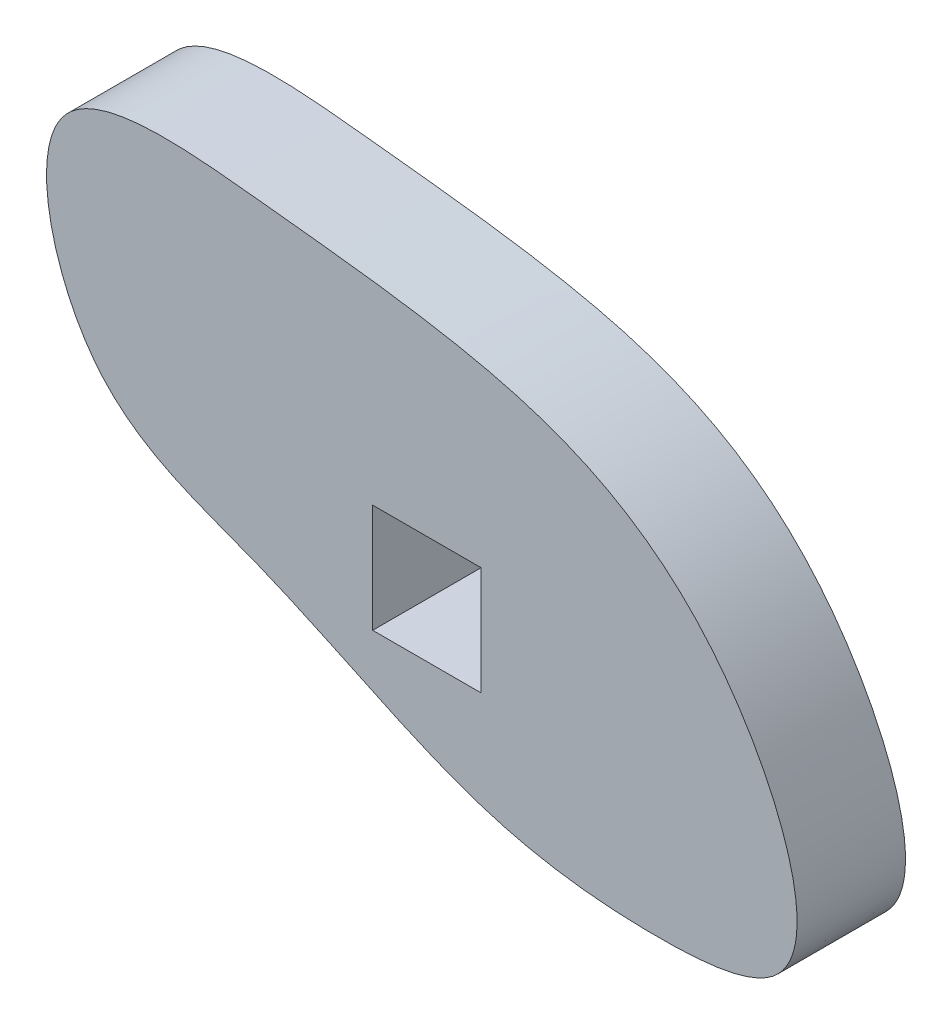
ISO-10303-21;
HEADER;
FILE_DESCRIPTION(('STEP AP214'),'2;1');
FILE_NAME('part.step','',(''),(''),'','','');
FILE_SCHEMA(('AUTOMOTIVE_DESIGN { 1 0 10303 214 1 1 1 1 }'));
ENDSEC;
DATA;
#1=APPLICATION_CONTEXT('core data for automotive mechanical design processes');
#2=APPLICATION_PROTOCOL_DEFINITION('international standard','automotive_design',2000,#1);
#3=PRODUCT_CONTEXT('',#1,'mechanical');
#4=PRODUCT('Part','Part','',(#3));
#5=PRODUCT_RELATED_PRODUCT_CATEGORY('part','',(#4));
#6=PRODUCT_DEFINITION_FORMATION('','',#4);
#7=PRODUCT_DEFINITION_CONTEXT('part definition',#1,'design');
#8=PRODUCT_DEFINITION('design','',#6,#7);
#9=PRODUCT_DEFINITION_SHAPE('','',#8);
#10=(LENGTH_UNIT() NAMED_UNIT(*) SI_UNIT(.MILLI.,.METRE.));
#11=(NAMED_UNIT(*) PLANE_ANGLE_UNIT() SI_UNIT($,.RADIAN.));
#12=(NAMED_UNIT(*) SI_UNIT($,.STERADIAN.) SOLID_ANGLE_UNIT());
#13=UNCERTAINTY_MEASURE_WITH_UNIT(LENGTH_MEASURE(1.E-05),#10,'distance_accuracy_value','');
#14=(GEOMETRIC_REPRESENTATION_CONTEXT(3) GLOBAL_UNCERTAINTY_ASSIGNED_CONTEXT((#13)) GLOBAL_UNIT_ASSIGNED_CONTEXT((#10,
#11,#12)) REPRESENTATION_CONTEXT('',''));
#15=CARTESIAN_POINT('',(0.,0.,0.));
#16=DIRECTION('',(0.,0.,1.));
#17=DIRECTION('',(1.,0.,0.));
#18=AXIS2_PLACEMENT_3D('',#15,#16,#17);
#19=CARTESIAN_POINT('',(6.23276976120048,65.2670859887159,1.524));
#20=DIRECTION('',(0.,0.,-1.));
#21=DIRECTION('',(-1.,0.,0.));
#22=AXIS2_PLACEMENT_3D('',#19,#20,#21);
#23=PLANE('',#22);
#24=CARTESIAN_POINT('',(7.78821083389061,59.6373775356015,1.524));
#25=CARTESIAN_POINT('',(8.55242861925409,59.3920195251449,1.524));
#26=CARTESIAN_POINT('',(9.87105853028132,59.2065251548185,1.524));
#27=CARTESIAN_POINT('',(12.9933090121217,59.4290503746136,1.524));
#28=CARTESIAN_POINT('',(11.1452780041047,64.0958208279682,1.524));
#29=CARTESIAN_POINT('',(7.76826039007349,65.1208617976935,1.524));
#30=CARTESIAN_POINT('',(4.81034353812184,65.4252300243392,1.524));
#31=CARTESIAN_POINT('',(1.10894430118295,65.8389714995074,1.524));
#32=CARTESIAN_POINT('',(2.04294960883038,61.8155299158975,1.524));
#33=CARTESIAN_POINT('',(4.95322939789916,61.021597326962,1.524));
#34=CARTESIAN_POINT('',(6.72903311877762,59.9774347050071,1.524));
#35=CARTESIAN_POINT('',(7.78821083389061,59.6373775356015,1.524));
#36=B_SPLINE_CURVE_WITH_KNOTS('',3,(#24,#25,#26,#27,#28,#29,#30,#31,#32,#33,#34,#35),
.UNSPECIFIED.,.T.,.F.,(4,1,1,1,1,1,1,1,1,4),(0.,0.094464637568492,0.158662880221809,
0.295651602533166,0.457810616264641,0.557025317189154,0.663282087189331,0.771859744080268,
0.869075490135075,1.),.UNSPECIFIED.);
#37=CARTESIAN_POINT('',(7.78821083389061,59.6373775356015,1.524));
#38=VERTEX_POINT('',#37);
#39=EDGE_CURVE('E11',#38,#38,#36,.T.);
#40=ORIENTED_EDGE('',*,*,#39,.T.);
#41=EDGE_LOOP('',(#40));
#42=FACE_BOUND('',#41,.T.);
#43=DIRECTION('',(0.,1.,0.));
#44=VECTOR('',#43,1.);
#45=CARTESIAN_POINT('',(7.78821083389061,62.5331543063582,1.524));
#46=LINE('',#45,#44);
#47=CARTESIAN_POINT('',(7.78821083389061,61.0091543063582,1.524));
#48=VERTEX_POINT('',#47);
#49=CARTESIAN_POINT('',(7.78821083389061,62.5331543063582,1.524));
#50=VERTEX_POINT('',#49);
#51=EDGE_CURVE('E74',#48,#50,#46,.T.);
#52=ORIENTED_EDGE('',*,*,#51,.F.);
#53=DIRECTION('',(1.,0.,0.));
#54=VECTOR('',#53,1.);
#55=CARTESIAN_POINT('',(7.78821083389061,61.0091543063582,1.524));
#56=LINE('',#55,#54);
#57=CARTESIAN_POINT('',(6.26421083389062,61.0091543063582,1.524));
#58=VERTEX_POINT('',#57);
#59=EDGE_CURVE('E95',#58,#48,#56,.T.);
#60=ORIENTED_EDGE('',*,*,#59,.F.);
#61=DIRECTION('',(0.,-1.,0.));
#62=VECTOR('',#61,1.);
#63=CARTESIAN_POINT('',(6.26421083389062,62.5331543063582,1.524));
#64=LINE('',#63,#62);
#65=CARTESIAN_POINT('',(6.26421083389062,62.5331543063582,1.524));
#66=VERTEX_POINT('',#65);
#67=EDGE_CURVE('E93',#66,#58,#64,.T.);
#68=ORIENTED_EDGE('',*,*,#67,.F.);
#69=DIRECTION('',(-1.,0.,0.));
#70=VECTOR('',#69,1.);
#71=CARTESIAN_POINT('',(7.78821083389061,62.5331543063582,1.524));
#72=LINE('',#71,#70);
#73=EDGE_CURVE('E82',#50,#66,#72,.T.);
#74=ORIENTED_EDGE('',*,*,#73,.F.);
#75=EDGE_LOOP('',(#52,#60,#68,#74));
#76=FACE_BOUND('',#75,.T.);
#77=ADVANCED_FACE('F31',(#42,#76),#23,.F.);
#78=CARTESIAN_POINT('',(6.23276976120048,65.2670859887159,0.));
#79=DIRECTION('',(0.,0.,-1.));
#80=DIRECTION('',(-1.,0.,0.));
#81=AXIS2_PLACEMENT_3D('',#78,#79,#80);
#82=PLANE('',#81);
#83=CARTESIAN_POINT('',(7.78821083389061,59.6373775356015,0.));
#84=CARTESIAN_POINT('',(8.55242861925409,59.3920195251449,0.));
#85=CARTESIAN_POINT('',(9.87105853028132,59.2065251548185,0.));
#86=CARTESIAN_POINT('',(12.9933090121217,59.4290503746136,0.));
#87=CARTESIAN_POINT('',(11.1452780041047,64.0958208279682,0.));
#88=CARTESIAN_POINT('',(7.76826039007349,65.1208617976935,0.));
#89=CARTESIAN_POINT('',(4.81034353812184,65.4252300243392,0.));
#90=CARTESIAN_POINT('',(1.10894430118295,65.8389714995074,0.));
#91=CARTESIAN_POINT('',(2.04294960883038,61.8155299158975,0.));
#92=CARTESIAN_POINT('',(4.95322939789916,61.021597326962,0.));
#93=CARTESIAN_POINT('',(6.72903311877762,59.9774347050071,0.));
#94=CARTESIAN_POINT('',(7.78821083389061,59.6373775356015,0.));
#95=B_SPLINE_CURVE_WITH_KNOTS('',3,(#83,#84,#85,#86,#87,#88,#89,#90,#91,#92,#93,#94),
.UNSPECIFIED.,.T.,.F.,(4,1,1,1,1,1,1,1,1,4),(0.,0.094464637568492,0.158662880221809,
0.295651602533166,0.457810616264641,0.557025317189154,0.663282087189331,0.771859744080268,
0.869075490135075,1.),.UNSPECIFIED.);
#96=CARTESIAN_POINT('',(7.78821083389061,59.6373775356015,0.));
#97=VERTEX_POINT('',#96);
#98=EDGE_CURVE('E36',#97,#97,#95,.T.);
#99=ORIENTED_EDGE('',*,*,#98,.F.);
#100=EDGE_LOOP('',(#99));
#101=FACE_BOUND('',#100,.T.);
#102=DIRECTION('',(1.,0.,0.));
#103=VECTOR('',#102,1.);
#104=CARTESIAN_POINT('',(7.78821083389061,61.0091543063582,0.));
#105=LINE('',#104,#103);
#106=CARTESIAN_POINT('',(6.26421083389062,61.0091543063582,0.));
#107=VERTEX_POINT('',#106);
#108=CARTESIAN_POINT('',(7.78821083389061,61.0091543063582,0.));
#109=VERTEX_POINT('',#108);
#110=EDGE_CURVE('E83',#107,#109,#105,.T.);
#111=ORIENTED_EDGE('',*,*,#110,.T.);
#112=DIRECTION('',(0.,1.,0.));
#113=VECTOR('',#112,1.);
#114=CARTESIAN_POINT('',(7.78821083389061,62.5331543063582,0.));
#115=LINE('',#114,#113);
#116=CARTESIAN_POINT('',(7.78821083389061,62.5331543063582,0.));
#117=VERTEX_POINT('',#116);
#118=EDGE_CURVE('E56',#109,#117,#115,.T.);
#119=ORIENTED_EDGE('',*,*,#118,.T.);
#120=DIRECTION('',(-1.,0.,0.));
#121=VECTOR('',#120,1.);
#122=CARTESIAN_POINT('',(7.78821083389061,62.5331543063582,0.));
#123=LINE('',#122,#121);
#124=CARTESIAN_POINT('',(6.26421083389062,62.5331543063582,0.));
#125=VERTEX_POINT('',#124);
#126=EDGE_CURVE('E89',#117,#125,#123,.T.);
#127=ORIENTED_EDGE('',*,*,#126,.T.);
#128=DIRECTION('',(0.,-1.,0.));
#129=VECTOR('',#128,1.);
#130=CARTESIAN_POINT('',(6.26421083389062,62.5331543063582,0.));
#131=LINE('',#130,#129);
#132=EDGE_CURVE('E101',#125,#107,#131,.T.);
#133=ORIENTED_EDGE('',*,*,#132,.T.);
#134=EDGE_LOOP('',(#111,#119,#127,#133));
#135=FACE_BOUND('',#134,.T.);
#136=ADVANCED_FACE('F118',(#101,#135),#82,.T.);
#137=DIRECTION('',(0.,0.,-1.));
#138=VECTOR('',#137,1.);
#139=SURFACE_OF_LINEAR_EXTRUSION('',#36,#138);
#140=ORIENTED_EDGE('',*,*,#39,.F.);
#141=EDGE_LOOP('',(#140));
#142=FACE_BOUND('',#141,.T.);
#143=ORIENTED_EDGE('',*,*,#98,.T.);
#144=EDGE_LOOP('',(#143));
#145=FACE_BOUND('',#144,.T.);
#146=ADVANCED_FACE('F33',(#142,#145),#139,.F.);
#147=CARTESIAN_POINT('',(7.78821083389061,62.5331543063582,1.524));
#148=DIRECTION('',(-1.,0.,0.));
#149=DIRECTION('',(0.,0.,1.));
#150=AXIS2_PLACEMENT_3D('',#147,#148,#149);
#151=PLANE('',#150);
#152=ORIENTED_EDGE('',*,*,#118,.F.);
#153=DIRECTION('',(0.,0.,-1.));
#154=VECTOR('',#153,1.);
#155=CARTESIAN_POINT('',(7.78821083389061,61.0091543063582,1.524));
#156=LINE('',#155,#154);
#157=EDGE_CURVE('E78',#48,#109,#156,.T.);
#158=ORIENTED_EDGE('',*,*,#157,.F.);
#159=ORIENTED_EDGE('',*,*,#51,.T.);
#160=DIRECTION('',(0.,0.,-1.));
#161=VECTOR('',#160,1.);
#162=CARTESIAN_POINT('',(7.78821083389061,62.5331543063582,1.524));
#163=LINE('',#162,#161);
#164=EDGE_CURVE('E77',#50,#117,#163,.T.);
#165=ORIENTED_EDGE('',*,*,#164,.T.);
#166=EDGE_LOOP('',(#152,#158,#159,#165));
#167=FACE_BOUND('',#166,.T.);
#168=ADVANCED_FACE('F76',(#167),#151,.T.);
#169=CARTESIAN_POINT('',(7.78821083389061,62.5331543063582,1.524));
#170=DIRECTION('',(0.,-1.,0.));
#171=DIRECTION('',(0.,0.,-1.));
#172=AXIS2_PLACEMENT_3D('',#169,#170,#171);
#173=PLANE('',#172);
#174=ORIENTED_EDGE('',*,*,#126,.F.);
#175=ORIENTED_EDGE('',*,*,#164,.F.);
#176=ORIENTED_EDGE('',*,*,#73,.T.);
#177=DIRECTION('',(0.,0.,-1.));
#178=VECTOR('',#177,1.);
#179=CARTESIAN_POINT('',(6.26421083389062,62.5331543063582,1.524));
#180=LINE('',#179,#178);
#181=EDGE_CURVE('E90',#66,#125,#180,.T.);
#182=ORIENTED_EDGE('',*,*,#181,.T.);
#183=EDGE_LOOP('',(#174,#175,#176,#182));
#184=FACE_BOUND('',#183,.T.);
#185=ADVANCED_FACE('F86',(#184),#173,.T.);
#186=CARTESIAN_POINT('',(6.26421083389062,62.5331543063582,1.524));
#187=DIRECTION('',(1.,0.,0.));
#188=DIRECTION('',(0.,0.,-1.));
#189=AXIS2_PLACEMENT_3D('',#186,#187,#188);
#190=PLANE('',#189);
#191=ORIENTED_EDGE('',*,*,#132,.F.);
#192=ORIENTED_EDGE('',*,*,#181,.F.);
#193=ORIENTED_EDGE('',*,*,#67,.T.);
#194=DIRECTION('',(0.,0.,-1.));
#195=VECTOR('',#194,1.);
#196=CARTESIAN_POINT('',(6.26421083389062,61.0091543063582,1.524));
#197=LINE('',#196,#195);
#198=EDGE_CURVE('E48',#58,#107,#197,.T.);
#199=ORIENTED_EDGE('',*,*,#198,.T.);
#200=EDGE_LOOP('',(#191,#192,#193,#199));
#201=FACE_BOUND('',#200,.T.);
#202=ADVANCED_FACE('F116',(#201),#190,.T.);
#203=CARTESIAN_POINT('',(7.78821083389061,61.0091543063582,1.524));
#204=DIRECTION('',(0.,1.,0.));
#205=DIRECTION('',(0.,0.,1.));
#206=AXIS2_PLACEMENT_3D('',#203,#204,#205);
#207=PLANE('',#206);
#208=ORIENTED_EDGE('',*,*,#110,.F.);
#209=ORIENTED_EDGE('',*,*,#198,.F.);
#210=ORIENTED_EDGE('',*,*,#59,.T.);
#211=ORIENTED_EDGE('',*,*,#157,.T.);
#212=EDGE_LOOP('',(#208,#209,#210,#211));
#213=FACE_BOUND('',#212,.T.);
#214=ADVANCED_FACE('F119',(#213),#207,.T.);
#215=CLOSED_SHELL('',(#77,#136,#146,#168,#185,#202,#214));
#216=MANIFOLD_SOLID_BREP('B2',#215);
#217=ADVANCED_BREP_SHAPE_REPRESENTATION('',(#18,#216),#14);
#218=SHAPE_DEFINITION_REPRESENTATION(#9,#217);
ENDSEC;
END-ISO-10303-21;
